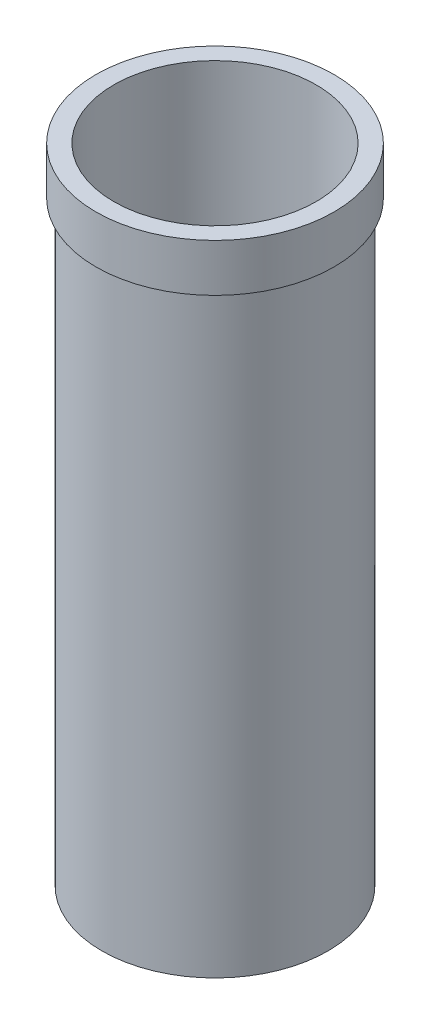
ISO-10303-21;
HEADER;
FILE_DESCRIPTION(('STEP AP214'),'2;1');
FILE_NAME('part.step','',(''),(''),'','','');
FILE_SCHEMA(('AUTOMOTIVE_DESIGN { 1 0 10303 214 1 1 1 1 }'));
ENDSEC;
DATA;
#1=APPLICATION_CONTEXT('core data for automotive mechanical design processes');
#2=APPLICATION_PROTOCOL_DEFINITION('international standard','automotive_design',2000,#1);
#3=PRODUCT_CONTEXT('',#1,'mechanical');
#4=PRODUCT('Part','Part','',(#3));
#5=PRODUCT_RELATED_PRODUCT_CATEGORY('part','',(#4));
#6=PRODUCT_DEFINITION_FORMATION('','',#4);
#7=PRODUCT_DEFINITION_CONTEXT('part definition',#1,'design');
#8=PRODUCT_DEFINITION('design','',#6,#7);
#9=PRODUCT_DEFINITION_SHAPE('','',#8);
#10=(LENGTH_UNIT() NAMED_UNIT(*) SI_UNIT(.MILLI.,.METRE.));
#11=(NAMED_UNIT(*) PLANE_ANGLE_UNIT() SI_UNIT($,.RADIAN.));
#12=(NAMED_UNIT(*) SI_UNIT($,.STERADIAN.) SOLID_ANGLE_UNIT());
#13=UNCERTAINTY_MEASURE_WITH_UNIT(LENGTH_MEASURE(1.E-05),#10,'distance_accuracy_value','');
#14=(GEOMETRIC_REPRESENTATION_CONTEXT(3) GLOBAL_UNCERTAINTY_ASSIGNED_CONTEXT((#13)) GLOBAL_UNIT_ASSIGNED_CONTEXT((#10,
#11,#12)) REPRESENTATION_CONTEXT('',''));
#15=CARTESIAN_POINT('',(0.,0.,0.));
#16=DIRECTION('',(0.,0.,1.));
#17=DIRECTION('',(1.,0.,0.));
#18=AXIS2_PLACEMENT_3D('',#15,#16,#17);
#19=CARTESIAN_POINT('',(0.,0.,0.));
#20=DIRECTION('',(0.,1.,0.));
#21=DIRECTION('',(0.,0.,1.));
#22=AXIS2_PLACEMENT_3D('',#19,#20,#21);
#23=PLANE('',#22);
#24=CARTESIAN_POINT('',(0.,0.,0.));
#25=DIRECTION('',(0.,1.,0.));
#26=DIRECTION('',(0.,0.,1.));
#27=AXIS2_PLACEMENT_3D('',#24,#25,#26);
#28=CIRCLE('',#27,4.75);
#29=CARTESIAN_POINT('',(0.,0.,4.75));
#30=VERTEX_POINT('',#29);
#31=EDGE_CURVE('E35',#30,#30,#28,.T.);
#32=ORIENTED_EDGE('',*,*,#31,.F.);
#33=EDGE_LOOP('',(#32));
#34=FACE_BOUND('',#33,.T.);
#35=CARTESIAN_POINT('',(0.,0.,0.));
#36=DIRECTION('',(0.,1.,0.));
#37=DIRECTION('',(0.,0.,1.));
#38=AXIS2_PLACEMENT_3D('',#35,#36,#37);
#39=CIRCLE('',#38,4.25);
#40=CARTESIAN_POINT('',(0.,0.,4.25));
#41=VERTEX_POINT('',#40);
#42=EDGE_CURVE('E42',#41,#41,#39,.T.);
#43=ORIENTED_EDGE('',*,*,#42,.T.);
#44=EDGE_LOOP('',(#43));
#45=FACE_BOUND('',#44,.T.);
#46=ADVANCED_FACE('F31',(#34,#45),#23,.F.);
#47=CARTESIAN_POINT('',(0.,25.,0.));
#48=DIRECTION('',(0.,-1.,0.));
#49=DIRECTION('',(0.,0.,-1.));
#50=AXIS2_PLACEMENT_3D('',#47,#48,#49);
#51=CYLINDRICAL_SURFACE('',#50,4.75);
#52=CARTESIAN_POINT('',(0.,25.,0.));
#53=DIRECTION('',(0.,1.,0.));
#54=DIRECTION('',(0.,0.,1.));
#55=AXIS2_PLACEMENT_3D('',#52,#53,#54);
#56=CIRCLE('',#55,4.75);
#57=CARTESIAN_POINT('',(0.,25.,4.75));
#58=VERTEX_POINT('',#57);
#59=EDGE_CURVE('E10',#58,#58,#56,.T.);
#60=ORIENTED_EDGE('',*,*,#59,.F.);
#61=EDGE_LOOP('',(#60));
#62=FACE_BOUND('',#61,.T.);
#63=ORIENTED_EDGE('',*,*,#31,.T.);
#64=EDGE_LOOP('',(#63));
#65=FACE_BOUND('',#64,.T.);
#66=ADVANCED_FACE('F33',(#62,#65),#51,.T.);
#67=CARTESIAN_POINT('',(0.,25.,0.));
#68=DIRECTION('',(0.,-1.,0.));
#69=DIRECTION('',(0.,0.,-1.));
#70=AXIS2_PLACEMENT_3D('',#67,#68,#69);
#71=CYLINDRICAL_SURFACE('',#70,4.25);
#72=ORIENTED_EDGE('',*,*,#42,.F.);
#73=EDGE_LOOP('',(#72));
#74=FACE_BOUND('',#73,.T.);
#75=CARTESIAN_POINT('',(0.,27.,0.));
#76=DIRECTION('',(0.,1.,0.));
#77=DIRECTION('',(0.,0.,1.));
#78=AXIS2_PLACEMENT_3D('',#75,#76,#77);
#79=CIRCLE('',#78,4.25);
#80=CARTESIAN_POINT('',(0.,27.,4.25));
#81=VERTEX_POINT('',#80);
#82=EDGE_CURVE('E50',#81,#81,#79,.T.);
#83=ORIENTED_EDGE('',*,*,#82,.T.);
#84=EDGE_LOOP('',(#83));
#85=FACE_BOUND('',#84,.T.);
#86=ADVANCED_FACE('F56',(#74,#85),#71,.F.);
#87=CARTESIAN_POINT('',(0.,27.,0.));
#88=DIRECTION('',(0.,1.,0.));
#89=DIRECTION('',(0.,0.,1.));
#90=AXIS2_PLACEMENT_3D('',#87,#88,#89);
#91=PLANE('',#90);
#92=CARTESIAN_POINT('',(0.,27.,0.));
#93=DIRECTION('',(0.,1.,0.));
#94=DIRECTION('',(0.,0.,1.));
#95=AXIS2_PLACEMENT_3D('',#92,#93,#94);
#96=CIRCLE('',#95,5.);
#97=CARTESIAN_POINT('',(0.,27.,5.));
#98=VERTEX_POINT('',#97);
#99=EDGE_CURVE('E46',#98,#98,#96,.T.);
#100=ORIENTED_EDGE('',*,*,#99,.T.);
#101=EDGE_LOOP('',(#100));
#102=FACE_BOUND('',#101,.T.);
#103=ORIENTED_EDGE('',*,*,#82,.F.);
#104=EDGE_LOOP('',(#103));
#105=FACE_BOUND('',#104,.T.);
#106=ADVANCED_FACE('F58',(#102,#105),#91,.T.);
#107=CARTESIAN_POINT('',(0.,25.,0.));
#108=DIRECTION('',(0.,1.,0.));
#109=DIRECTION('',(0.,0.,1.));
#110=AXIS2_PLACEMENT_3D('',#107,#108,#109);
#111=PLANE('',#110);
#112=ORIENTED_EDGE('',*,*,#59,.T.);
#113=EDGE_LOOP('',(#112));
#114=FACE_BOUND('',#113,.T.);
#115=CARTESIAN_POINT('',(0.,25.,0.));
#116=DIRECTION('',(0.,1.,0.));
#117=DIRECTION('',(0.,0.,1.));
#118=AXIS2_PLACEMENT_3D('',#115,#116,#117);
#119=CIRCLE('',#118,5.);
#120=CARTESIAN_POINT('',(0.,25.,5.));
#121=VERTEX_POINT('',#120);
#122=EDGE_CURVE('E47',#121,#121,#119,.T.);
#123=ORIENTED_EDGE('',*,*,#122,.F.);
#124=EDGE_LOOP('',(#123));
#125=FACE_BOUND('',#124,.T.);
#126=ADVANCED_FACE('F60',(#114,#125),#111,.F.);
#127=CARTESIAN_POINT('',(0.,27.,0.));
#128=DIRECTION('',(0.,-1.,0.));
#129=DIRECTION('',(0.,0.,-1.));
#130=AXIS2_PLACEMENT_3D('',#127,#128,#129);
#131=CYLINDRICAL_SURFACE('',#130,5.);
#132=ORIENTED_EDGE('',*,*,#99,.F.);
#133=EDGE_LOOP('',(#132));
#134=FACE_BOUND('',#133,.T.);
#135=ORIENTED_EDGE('',*,*,#122,.T.);
#136=EDGE_LOOP('',(#135));
#137=FACE_BOUND('',#136,.T.);
#138=ADVANCED_FACE('F67',(#134,#137),#131,.T.);
#139=CLOSED_SHELL('',(#46,#66,#86,#106,#126,#138));
#140=MANIFOLD_SOLID_BREP('B2',#139);
#141=ADVANCED_BREP_SHAPE_REPRESENTATION('',(#18,#140),#14);
#142=SHAPE_DEFINITION_REPRESENTATION(#9,#141);
ENDSEC;
END-ISO-10303-21;
